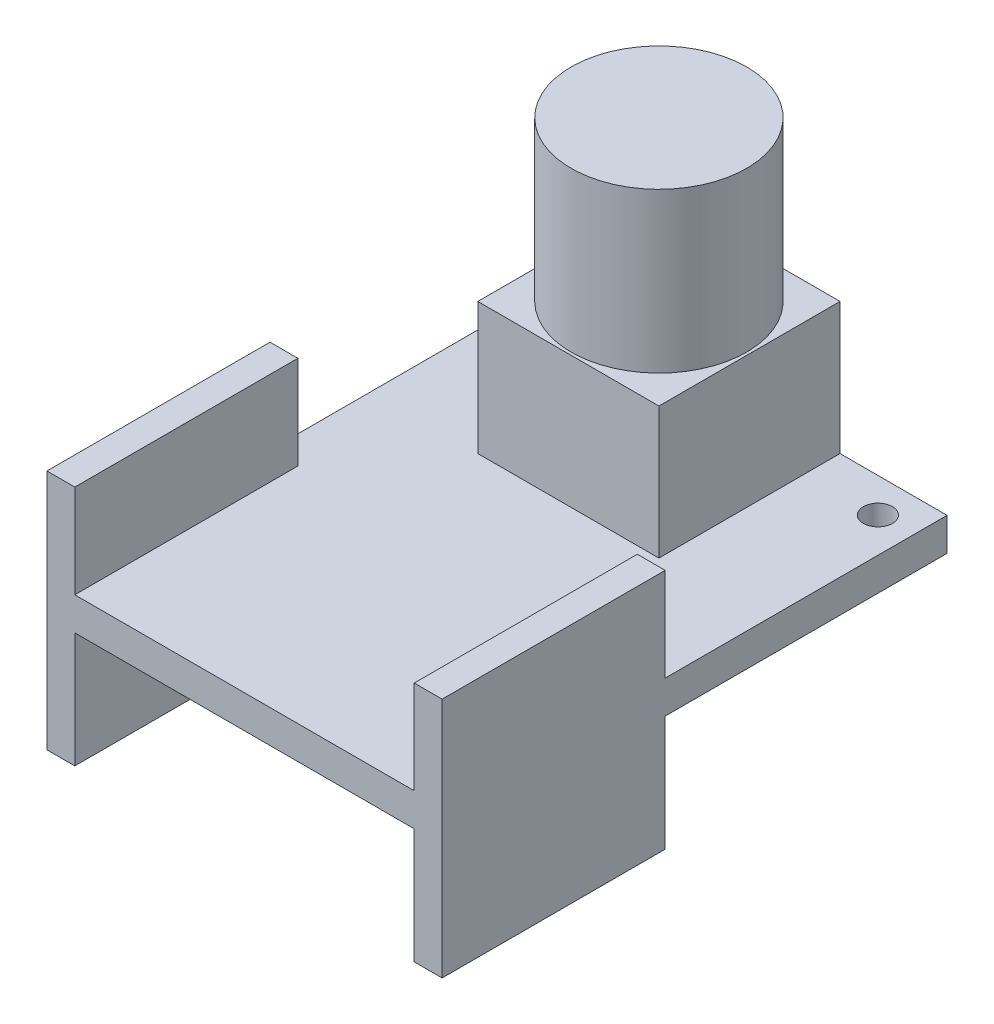
ISO-10303-21;
HEADER;
FILE_DESCRIPTION(('STEP AP214'),'2;1');
FILE_NAME('part.step','',(''),(''),'','','');
FILE_SCHEMA(('AUTOMOTIVE_DESIGN { 1 0 10303 214 1 1 1 1 }'));
ENDSEC;
DATA;
#1=APPLICATION_CONTEXT('core data for automotive mechanical design processes');
#2=APPLICATION_PROTOCOL_DEFINITION('international standard','automotive_design',2000,#1);
#3=PRODUCT_CONTEXT('',#1,'mechanical');
#4=PRODUCT('Part','Part','',(#3));
#5=PRODUCT_RELATED_PRODUCT_CATEGORY('part','',(#4));
#6=PRODUCT_DEFINITION_FORMATION('','',#4);
#7=PRODUCT_DEFINITION_CONTEXT('part definition',#1,'design');
#8=PRODUCT_DEFINITION('design','',#6,#7);
#9=PRODUCT_DEFINITION_SHAPE('','',#8);
#10=(LENGTH_UNIT() NAMED_UNIT(*) SI_UNIT(.MILLI.,.METRE.));
#11=(NAMED_UNIT(*) PLANE_ANGLE_UNIT() SI_UNIT($,.RADIAN.));
#12=(NAMED_UNIT(*) SI_UNIT($,.STERADIAN.) SOLID_ANGLE_UNIT());
#13=UNCERTAINTY_MEASURE_WITH_UNIT(LENGTH_MEASURE(1.E-05),#10,'distance_accuracy_value','');
#14=(GEOMETRIC_REPRESENTATION_CONTEXT(3) GLOBAL_UNCERTAINTY_ASSIGNED_CONTEXT((#13)) GLOBAL_UNIT_ASSIGNED_CONTEXT((#10,
#11,#12)) REPRESENTATION_CONTEXT('',''));
#15=CARTESIAN_POINT('',(0.,0.,0.));
#16=DIRECTION('',(0.,0.,1.));
#17=DIRECTION('',(1.,0.,0.));
#18=AXIS2_PLACEMENT_3D('',#15,#16,#17);
#19=CARTESIAN_POINT('',(18.,3.,23.));
#20=DIRECTION('',(-1.,0.,0.));
#21=DIRECTION('',(0.,0.,1.));
#22=AXIS2_PLACEMENT_3D('',#19,#20,#21);
#23=PLANE('',#22);
#24=DIRECTION('',(0.,0.,-1.));
#25=VECTOR('',#24,1.);
#26=CARTESIAN_POINT('',(18.,3.,23.));
#27=LINE('',#26,#25);
#28=CARTESIAN_POINT('',(18.,3.,2.68));
#29=VERTEX_POINT('',#28);
#30=CARTESIAN_POINT('',(18.,3.,-23.));
#31=VERTEX_POINT('',#30);
#32=EDGE_CURVE('E303',#29,#31,#27,.T.);
#33=ORIENTED_EDGE('',*,*,#32,.F.);
#34=DIRECTION('',(0.,1.,0.));
#35=VECTOR('',#34,1.);
#36=CARTESIAN_POINT('',(18.,-10.5,2.68));
#37=LINE('',#36,#35);
#38=CARTESIAN_POINT('',(18.,11.5,2.68));
#39=VERTEX_POINT('',#38);
#40=EDGE_CURVE('E286',#29,#39,#37,.T.);
#41=ORIENTED_EDGE('',*,*,#40,.T.);
#42=DIRECTION('',(0.,0.,-1.));
#43=VECTOR('',#42,1.);
#44=CARTESIAN_POINT('',(18.,11.5,23.));
#45=LINE('',#44,#43);
#46=CARTESIAN_POINT('',(18.,11.5,23.));
#47=VERTEX_POINT('',#46);
#48=EDGE_CURVE('E265',#47,#39,#45,.T.);
#49=ORIENTED_EDGE('',*,*,#48,.F.);
#50=DIRECTION('',(0.,-1.,0.));
#51=VECTOR('',#50,1.);
#52=CARTESIAN_POINT('',(18.,3.,23.));
#53=LINE('',#52,#51);
#54=CARTESIAN_POINT('',(18.,-10.5,23.));
#55=VERTEX_POINT('',#54);
#56=EDGE_CURVE('E313',#47,#55,#53,.T.);
#57=ORIENTED_EDGE('',*,*,#56,.T.);
#58=DIRECTION('',(0.,0.,-1.));
#59=VECTOR('',#58,1.);
#60=CARTESIAN_POINT('',(18.,-10.5,23.));
#61=LINE('',#60,#59);
#62=CARTESIAN_POINT('',(18.,-10.5,2.68));
#63=VERTEX_POINT('',#62);
#64=EDGE_CURVE('E277',#55,#63,#61,.T.);
#65=ORIENTED_EDGE('',*,*,#64,.T.);
#66=CARTESIAN_POINT('',(18.,0.,2.68));
#67=VERTEX_POINT('',#66);
#68=EDGE_CURVE('E296',#63,#67,#37,.T.);
#69=ORIENTED_EDGE('',*,*,#68,.T.);
#70=DIRECTION('',(0.,0.,-1.));
#71=VECTOR('',#70,1.);
#72=CARTESIAN_POINT('',(18.,0.,23.));
#73=LINE('',#72,#71);
#74=CARTESIAN_POINT('',(18.,0.,-23.));
#75=VERTEX_POINT('',#74);
#76=EDGE_CURVE('E302',#67,#75,#73,.T.);
#77=ORIENTED_EDGE('',*,*,#76,.T.);
#78=DIRECTION('',(0.,-1.,0.));
#79=VECTOR('',#78,1.);
#80=CARTESIAN_POINT('',(18.,3.,-23.));
#81=LINE('',#80,#79);
#82=EDGE_CURVE('E327',#31,#75,#81,.T.);
#83=ORIENTED_EDGE('',*,*,#82,.F.);
#84=EDGE_LOOP('',(#33,#41,#49,#57,#65,#69,#77,#83));
#85=FACE_BOUND('',#84,.T.);
#86=ADVANCED_FACE('F48',(#85),#23,.F.);
#87=CARTESIAN_POINT('',(-18.,3.,-23.));
#88=DIRECTION('',(0.,0.,1.));
#89=DIRECTION('',(1.,0.,0.));
#90=AXIS2_PLACEMENT_3D('',#87,#88,#89);
#91=PLANE('',#90);
#92=DIRECTION('',(-1.,0.,0.));
#93=VECTOR('',#92,1.);
#94=CARTESIAN_POINT('',(-18.,0.,-23.));
#95=LINE('',#94,#93);
#96=CARTESIAN_POINT('',(-18.,0.,-23.));
#97=VERTEX_POINT('',#96);
#98=EDGE_CURVE('E315',#75,#97,#95,.T.);
#99=ORIENTED_EDGE('',*,*,#98,.T.);
#100=DIRECTION('',(0.,-1.,0.));
#101=VECTOR('',#100,1.);
#102=CARTESIAN_POINT('',(-18.,3.,-23.));
#103=LINE('',#102,#101);
#104=CARTESIAN_POINT('',(-18.,3.,-23.));
#105=VERTEX_POINT('',#104);
#106=EDGE_CURVE('E324',#105,#97,#103,.T.);
#107=ORIENTED_EDGE('',*,*,#106,.F.);
#108=DIRECTION('',(-1.,0.,0.));
#109=VECTOR('',#108,1.);
#110=CARTESIAN_POINT('',(-18.,3.,-23.));
#111=LINE('',#110,#109);
#112=CARTESIAN_POINT('',(-8.25,3.,-23.));
#113=VERTEX_POINT('',#112);
#114=EDGE_CURVE('E305',#113,#105,#111,.T.);
#115=ORIENTED_EDGE('',*,*,#114,.F.);
#116=DIRECTION('',(0.,1.,0.));
#117=VECTOR('',#116,1.);
#118=CARTESIAN_POINT('',(-8.25,-10.5,-23.));
#119=LINE('',#118,#117);
#120=CARTESIAN_POINT('',(-8.25,15.,-23.));
#121=VERTEX_POINT('',#120);
#122=EDGE_CURVE('E217',#113,#121,#119,.T.);
#123=ORIENTED_EDGE('',*,*,#122,.T.);
#124=DIRECTION('',(-1.,0.,0.));
#125=VECTOR('',#124,1.);
#126=CARTESIAN_POINT('',(8.25,15.,-23.));
#127=LINE('',#126,#125);
#128=CARTESIAN_POINT('',(8.25,15.,-23.));
#129=VERTEX_POINT('',#128);
#130=EDGE_CURVE('E203',#129,#121,#127,.T.);
#131=ORIENTED_EDGE('',*,*,#130,.F.);
#132=DIRECTION('',(0.,1.,0.));
#133=VECTOR('',#132,1.);
#134=CARTESIAN_POINT('',(8.25,-10.5,-23.));
#135=LINE('',#134,#133);
#136=CARTESIAN_POINT('',(8.25,3.,-23.));
#137=VERTEX_POINT('',#136);
#138=EDGE_CURVE('E199',#137,#129,#135,.T.);
#139=ORIENTED_EDGE('',*,*,#138,.F.);
#140=EDGE_CURVE('E307',#31,#137,#111,.T.);
#141=ORIENTED_EDGE('',*,*,#140,.F.);
#142=ORIENTED_EDGE('',*,*,#82,.T.);
#143=EDGE_LOOP('',(#99,#107,#115,#123,#131,#139,#141,#142));
#144=FACE_BOUND('',#143,.T.);
#145=ADVANCED_FACE('F363',(#144),#91,.F.);
#146=CARTESIAN_POINT('',(-18.,3.,23.));
#147=DIRECTION('',(1.,0.,0.));
#148=DIRECTION('',(0.,0.,-1.));
#149=AXIS2_PLACEMENT_3D('',#146,#147,#148);
#150=PLANE('',#149);
#151=DIRECTION('',(0.,0.,1.));
#152=VECTOR('',#151,1.);
#153=CARTESIAN_POINT('',(-18.,0.,23.));
#154=LINE('',#153,#152);
#155=CARTESIAN_POINT('',(-18.,0.,2.68));
#156=VERTEX_POINT('',#155);
#157=EDGE_CURVE('E317',#97,#156,#154,.T.);
#158=ORIENTED_EDGE('',*,*,#157,.T.);
#159=DIRECTION('',(0.,1.,0.));
#160=VECTOR('',#159,1.);
#161=CARTESIAN_POINT('',(-18.,-10.5,2.68));
#162=LINE('',#161,#160);
#163=CARTESIAN_POINT('',(-18.,-10.5,2.68));
#164=VERTEX_POINT('',#163);
#165=EDGE_CURVE('E224',#164,#156,#162,.T.);
#166=ORIENTED_EDGE('',*,*,#165,.F.);
#167=DIRECTION('',(0.,0.,1.));
#168=VECTOR('',#167,1.);
#169=CARTESIAN_POINT('',(-18.,-10.5,23.));
#170=LINE('',#169,#168);
#171=CARTESIAN_POINT('',(-18.,-10.5,23.));
#172=VERTEX_POINT('',#171);
#173=EDGE_CURVE('E240',#164,#172,#170,.T.);
#174=ORIENTED_EDGE('',*,*,#173,.T.);
#175=DIRECTION('',(0.,-1.,0.));
#176=VECTOR('',#175,1.);
#177=CARTESIAN_POINT('',(-18.,3.,23.));
#178=LINE('',#177,#176);
#179=CARTESIAN_POINT('',(-18.,11.5,23.));
#180=VERTEX_POINT('',#179);
#181=EDGE_CURVE('E322',#180,#172,#178,.T.);
#182=ORIENTED_EDGE('',*,*,#181,.F.);
#183=DIRECTION('',(0.,0.,1.));
#184=VECTOR('',#183,1.);
#185=CARTESIAN_POINT('',(-18.,11.5,23.));
#186=LINE('',#185,#184);
#187=CARTESIAN_POINT('',(-18.,11.5,2.68));
#188=VERTEX_POINT('',#187);
#189=EDGE_CURVE('E252',#188,#180,#186,.T.);
#190=ORIENTED_EDGE('',*,*,#189,.F.);
#191=CARTESIAN_POINT('',(-18.,3.,2.68));
#192=VERTEX_POINT('',#191);
#193=EDGE_CURVE('E227',#192,#188,#162,.T.);
#194=ORIENTED_EDGE('',*,*,#193,.F.);
#195=DIRECTION('',(0.,0.,1.));
#196=VECTOR('',#195,1.);
#197=CARTESIAN_POINT('',(-18.,3.,23.));
#198=LINE('',#197,#196);
#199=EDGE_CURVE('E309',#105,#192,#198,.T.);
#200=ORIENTED_EDGE('',*,*,#199,.F.);
#201=ORIENTED_EDGE('',*,*,#106,.T.);
#202=EDGE_LOOP('',(#158,#166,#174,#182,#190,#194,#200,#201));
#203=FACE_BOUND('',#202,.T.);
#204=ADVANCED_FACE('F374',(#203),#150,.F.);
#205=CARTESIAN_POINT('',(-18.,3.,23.));
#206=DIRECTION('',(0.,0.,-1.));
#207=DIRECTION('',(-1.,0.,0.));
#208=AXIS2_PLACEMENT_3D('',#205,#206,#207);
#209=PLANE('',#208);
#210=DIRECTION('',(1.,0.,0.));
#211=VECTOR('',#210,1.);
#212=CARTESIAN_POINT('',(-18.,3.,23.));
#213=LINE('',#212,#211);
#214=CARTESIAN_POINT('',(-15.46,3.,23.));
#215=VERTEX_POINT('',#214);
#216=CARTESIAN_POINT('',(15.46,3.,23.));
#217=VERTEX_POINT('',#216);
#218=EDGE_CURVE('E311',#215,#217,#213,.T.);
#219=ORIENTED_EDGE('',*,*,#218,.F.);
#220=DIRECTION('',(0.,1.,0.));
#221=VECTOR('',#220,1.);
#222=CARTESIAN_POINT('',(-15.46,-10.5,23.));
#223=LINE('',#222,#221);
#224=CARTESIAN_POINT('',(-15.46,11.5,23.));
#225=VERTEX_POINT('',#224);
#226=EDGE_CURVE('E231',#215,#225,#223,.T.);
#227=ORIENTED_EDGE('',*,*,#226,.T.);
#228=DIRECTION('',(1.,0.,0.));
#229=VECTOR('',#228,1.);
#230=CARTESIAN_POINT('',(-15.46,11.5,23.));
#231=LINE('',#230,#229);
#232=EDGE_CURVE('E249',#180,#225,#231,.T.);
#233=ORIENTED_EDGE('',*,*,#232,.F.);
#234=ORIENTED_EDGE('',*,*,#181,.T.);
#235=DIRECTION('',(1.,0.,0.));
#236=VECTOR('',#235,1.);
#237=CARTESIAN_POINT('',(-15.46,-10.5,23.));
#238=LINE('',#237,#236);
#239=CARTESIAN_POINT('',(-15.46,-10.5,23.));
#240=VERTEX_POINT('',#239);
#241=EDGE_CURVE('E237',#172,#240,#238,.T.);
#242=ORIENTED_EDGE('',*,*,#241,.T.);
#243=CARTESIAN_POINT('',(-15.46,0.,23.));
#244=VERTEX_POINT('',#243);
#245=EDGE_CURVE('E228',#240,#244,#223,.T.);
#246=ORIENTED_EDGE('',*,*,#245,.T.);
#247=DIRECTION('',(1.,0.,0.));
#248=VECTOR('',#247,1.);
#249=CARTESIAN_POINT('',(-18.,0.,23.));
#250=LINE('',#249,#248);
#251=CARTESIAN_POINT('',(15.46,0.,23.));
#252=VERTEX_POINT('',#251);
#253=EDGE_CURVE('E306',#244,#252,#250,.T.);
#254=ORIENTED_EDGE('',*,*,#253,.T.);
#255=DIRECTION('',(0.,1.,0.));
#256=VECTOR('',#255,1.);
#257=CARTESIAN_POINT('',(15.46,-10.5,23.));
#258=LINE('',#257,#256);
#259=CARTESIAN_POINT('',(15.46,-10.5,23.));
#260=VERTEX_POINT('',#259);
#261=EDGE_CURVE('E287',#260,#252,#258,.T.);
#262=ORIENTED_EDGE('',*,*,#261,.F.);
#263=DIRECTION('',(1.,0.,0.));
#264=VECTOR('',#263,1.);
#265=CARTESIAN_POINT('',(15.46,-10.5,23.));
#266=LINE('',#265,#264);
#267=EDGE_CURVE('E274',#260,#55,#266,.T.);
#268=ORIENTED_EDGE('',*,*,#267,.T.);
#269=ORIENTED_EDGE('',*,*,#56,.F.);
#270=DIRECTION('',(1.,0.,0.));
#271=VECTOR('',#270,1.);
#272=CARTESIAN_POINT('',(15.46,11.5,23.));
#273=LINE('',#272,#271);
#274=CARTESIAN_POINT('',(15.46,11.5,23.));
#275=VERTEX_POINT('',#274);
#276=EDGE_CURVE('E262',#275,#47,#273,.T.);
#277=ORIENTED_EDGE('',*,*,#276,.F.);
#278=EDGE_CURVE('E291',#217,#275,#258,.T.);
#279=ORIENTED_EDGE('',*,*,#278,.F.);
#280=EDGE_LOOP('',(#219,#227,#233,#234,#242,#246,#254,#262,#268,#269,#277,#279));
#281=FACE_BOUND('',#280,.T.);
#282=ADVANCED_FACE('F357',(#281),#209,.F.);
#283=CARTESIAN_POINT('',(0.,3.,0.));
#284=DIRECTION('',(0.,-1.,0.));
#285=DIRECTION('',(0.,0.,-1.));
#286=AXIS2_PLACEMENT_3D('',#283,#284,#285);
#287=PLANE('',#286);
#288=CARTESIAN_POINT('',(-14.825,3.,-19.875));
#289=DIRECTION('',(0.,1.,0.));
#290=DIRECTION('',(0.,0.,1.));
#291=AXIS2_PLACEMENT_3D('',#288,#289,#290);
#292=CIRCLE('',#291,1.325);
#293=CARTESIAN_POINT('',(-14.825,3.,-18.55));
#294=VERTEX_POINT('',#293);
#295=EDGE_CURVE('E339',#294,#294,#292,.T.);
#296=ORIENTED_EDGE('',*,*,#295,.F.);
#297=EDGE_LOOP('',(#296));
#298=FACE_BOUND('',#297,.T.);
#299=CARTESIAN_POINT('',(14.825,3.,-19.875));
#300=DIRECTION('',(0.,1.,0.));
#301=DIRECTION('',(0.,0.,-1.));
#302=AXIS2_PLACEMENT_3D('',#299,#300,#301);
#303=CIRCLE('',#302,1.325);
#304=CARTESIAN_POINT('',(14.825,3.,-18.55));
#305=VERTEX_POINT('',#304);
#306=EDGE_CURVE('E344',#305,#305,#303,.T.);
#307=ORIENTED_EDGE('',*,*,#306,.F.);
#308=EDGE_LOOP('',(#307));
#309=FACE_BOUND('',#308,.T.);
#310=ORIENTED_EDGE('',*,*,#140,.T.);
#311=DIRECTION('',(0.,0.,1.));
#312=VECTOR('',#311,1.);
#313=CARTESIAN_POINT('',(8.25,3.,0.));
#314=LINE('',#313,#312);
#315=CARTESIAN_POINT('',(8.25,3.,-6.5));
#316=VERTEX_POINT('',#315);
#317=EDGE_CURVE('E64',#137,#316,#314,.T.);
#318=ORIENTED_EDGE('',*,*,#317,.T.);
#319=DIRECTION('',(-1.,0.,0.));
#320=VECTOR('',#319,1.);
#321=CARTESIAN_POINT('',(0.,3.,-6.5));
#322=LINE('',#321,#320);
#323=CARTESIAN_POINT('',(-8.25,3.,-6.5));
#324=VERTEX_POINT('',#323);
#325=EDGE_CURVE('E68',#316,#324,#322,.T.);
#326=ORIENTED_EDGE('',*,*,#325,.T.);
#327=DIRECTION('',(0.,0.,-1.));
#328=VECTOR('',#327,1.);
#329=CARTESIAN_POINT('',(-8.25,3.,0.));
#330=LINE('',#329,#328);
#331=EDGE_CURVE('E216',#324,#113,#330,.T.);
#332=ORIENTED_EDGE('',*,*,#331,.T.);
#333=ORIENTED_EDGE('',*,*,#114,.T.);
#334=ORIENTED_EDGE('',*,*,#199,.T.);
#335=DIRECTION('',(1.,0.,0.));
#336=VECTOR('',#335,1.);
#337=CARTESIAN_POINT('',(0.,3.,2.68));
#338=LINE('',#337,#336);
#339=CARTESIAN_POINT('',(-15.46,3.,2.68));
#340=VERTEX_POINT('',#339);
#341=EDGE_CURVE('E260',#192,#340,#338,.T.);
#342=ORIENTED_EDGE('',*,*,#341,.T.);
#343=DIRECTION('',(0.,0.,1.));
#344=VECTOR('',#343,1.);
#345=CARTESIAN_POINT('',(-15.46,3.,0.));
#346=LINE('',#345,#344);
#347=EDGE_CURVE('E258',#340,#215,#346,.T.);
#348=ORIENTED_EDGE('',*,*,#347,.T.);
#349=ORIENTED_EDGE('',*,*,#218,.T.);
#350=DIRECTION('',(0.,0.,-1.));
#351=VECTOR('',#350,1.);
#352=CARTESIAN_POINT('',(15.46,3.,0.));
#353=LINE('',#352,#351);
#354=CARTESIAN_POINT('',(15.46,3.,2.68));
#355=VERTEX_POINT('',#354);
#356=EDGE_CURVE('E300',#217,#355,#353,.T.);
#357=ORIENTED_EDGE('',*,*,#356,.T.);
#358=DIRECTION('',(1.,0.,0.));
#359=VECTOR('',#358,1.);
#360=CARTESIAN_POINT('',(0.,3.,2.68));
#361=LINE('',#360,#359);
#362=EDGE_CURVE('E290',#355,#29,#361,.T.);
#363=ORIENTED_EDGE('',*,*,#362,.T.);
#364=ORIENTED_EDGE('',*,*,#32,.T.);
#365=EDGE_LOOP('',(#310,#318,#326,#332,#333,#334,#342,#348,#349,#357,#363,#364));
#366=FACE_BOUND('',#365,.T.);
#367=ADVANCED_FACE('F354',(#298,#309,#366),#287,.F.);
#368=CARTESIAN_POINT('',(0.,0.,0.));
#369=DIRECTION('',(0.,-1.,0.));
#370=DIRECTION('',(0.,0.,-1.));
#371=AXIS2_PLACEMENT_3D('',#368,#369,#370);
#372=PLANE('',#371);
#373=ORIENTED_EDGE('',*,*,#157,.F.);
#374=ORIENTED_EDGE('',*,*,#98,.F.);
#375=ORIENTED_EDGE('',*,*,#76,.F.);
#376=DIRECTION('',(1.,0.,0.));
#377=VECTOR('',#376,1.);
#378=CARTESIAN_POINT('',(0.,0.,2.68));
#379=LINE('',#378,#377);
#380=CARTESIAN_POINT('',(15.46,0.,2.68));
#381=VERTEX_POINT('',#380);
#382=EDGE_CURVE('E330',#381,#67,#379,.T.);
#383=ORIENTED_EDGE('',*,*,#382,.F.);
#384=DIRECTION('',(0.,0.,-1.));
#385=VECTOR('',#384,1.);
#386=CARTESIAN_POINT('',(15.46,0.,0.));
#387=LINE('',#386,#385);
#388=EDGE_CURVE('E333',#252,#381,#387,.T.);
#389=ORIENTED_EDGE('',*,*,#388,.F.);
#390=ORIENTED_EDGE('',*,*,#253,.F.);
#391=DIRECTION('',(0.,0.,1.));
#392=VECTOR('',#391,1.);
#393=CARTESIAN_POINT('',(-15.46,0.,0.));
#394=LINE('',#393,#392);
#395=CARTESIAN_POINT('',(-15.46,0.,2.68));
#396=VERTEX_POINT('',#395);
#397=EDGE_CURVE('E335',#396,#244,#394,.T.);
#398=ORIENTED_EDGE('',*,*,#397,.F.);
#399=DIRECTION('',(1.,0.,0.));
#400=VECTOR('',#399,1.);
#401=CARTESIAN_POINT('',(0.,0.,2.68));
#402=LINE('',#401,#400);
#403=EDGE_CURVE('E56',#156,#396,#402,.T.);
#404=ORIENTED_EDGE('',*,*,#403,.F.);
#405=EDGE_LOOP('',(#373,#374,#375,#383,#389,#390,#398,#404));
#406=FACE_BOUND('',#405,.T.);
#407=CARTESIAN_POINT('',(-14.825,0.,-19.875));
#408=DIRECTION('',(0.,-1.,0.));
#409=DIRECTION('',(0.,0.,-1.));
#410=AXIS2_PLACEMENT_3D('',#407,#408,#409);
#411=CIRCLE('',#410,1.325);
#412=CARTESIAN_POINT('',(-14.825,0.,-18.55));
#413=VERTEX_POINT('',#412);
#414=EDGE_CURVE('E51',#413,#413,#411,.T.);
#415=ORIENTED_EDGE('',*,*,#414,.F.);
#416=EDGE_LOOP('',(#415));
#417=FACE_BOUND('',#416,.T.);
#418=CARTESIAN_POINT('',(14.825,0.,-19.875));
#419=DIRECTION('',(0.,-1.,0.));
#420=DIRECTION('',(0.,0.,-1.));
#421=AXIS2_PLACEMENT_3D('',#418,#419,#420);
#422=CIRCLE('',#421,1.325);
#423=CARTESIAN_POINT('',(14.825,0.,-18.55));
#424=VERTEX_POINT('',#423);
#425=EDGE_CURVE('E337',#424,#424,#422,.T.);
#426=ORIENTED_EDGE('',*,*,#425,.F.);
#427=EDGE_LOOP('',(#426));
#428=FACE_BOUND('',#427,.T.);
#429=ADVANCED_FACE('F356',(#406,#417,#428),#372,.T.);
#430=CARTESIAN_POINT('',(0.,-10.5,0.));
#431=DIRECTION('',(0.,1.,0.));
#432=DIRECTION('',(0.,0.,1.));
#433=AXIS2_PLACEMENT_3D('',#430,#431,#432);
#434=PLANE('',#433);
#435=ORIENTED_EDGE('',*,*,#267,.F.);
#436=DIRECTION('',(0.,0.,1.));
#437=VECTOR('',#436,1.);
#438=CARTESIAN_POINT('',(15.46,-10.5,2.68));
#439=LINE('',#438,#437);
#440=CARTESIAN_POINT('',(15.46,-10.5,2.68));
#441=VERTEX_POINT('',#440);
#442=EDGE_CURVE('E283',#441,#260,#439,.T.);
#443=ORIENTED_EDGE('',*,*,#442,.F.);
#444=DIRECTION('',(-1.,0.,0.));
#445=VECTOR('',#444,1.);
#446=CARTESIAN_POINT('',(18.,-10.5,2.68));
#447=LINE('',#446,#445);
#448=EDGE_CURVE('E280',#63,#441,#447,.T.);
#449=ORIENTED_EDGE('',*,*,#448,.F.);
#450=ORIENTED_EDGE('',*,*,#64,.F.);
#451=EDGE_LOOP('',(#435,#443,#449,#450));
#452=FACE_BOUND('',#451,.T.);
#453=ADVANCED_FACE('F425',(#452),#434,.F.);
#454=CARTESIAN_POINT('',(18.,-10.5,2.68));
#455=DIRECTION('',(0.,0.,-1.));
#456=DIRECTION('',(-1.,0.,0.));
#457=AXIS2_PLACEMENT_3D('',#454,#455,#456);
#458=PLANE('',#457);
#459=DIRECTION('',(0.,1.,0.));
#460=VECTOR('',#459,1.);
#461=CARTESIAN_POINT('',(15.46,-10.5,2.68));
#462=LINE('',#461,#460);
#463=EDGE_CURVE('E292',#441,#381,#462,.T.);
#464=ORIENTED_EDGE('',*,*,#463,.T.);
#465=ORIENTED_EDGE('',*,*,#382,.T.);
#466=ORIENTED_EDGE('',*,*,#68,.F.);
#467=ORIENTED_EDGE('',*,*,#448,.T.);
#468=EDGE_LOOP('',(#464,#465,#466,#467));
#469=FACE_BOUND('',#468,.T.);
#470=ADVANCED_FACE('F428',(#469),#458,.T.);
#471=CARTESIAN_POINT('',(15.46,-10.5,2.68));
#472=DIRECTION('',(-1.,0.,0.));
#473=DIRECTION('',(0.,0.,1.));
#474=AXIS2_PLACEMENT_3D('',#471,#472,#473);
#475=PLANE('',#474);
#476=ORIENTED_EDGE('',*,*,#261,.T.);
#477=ORIENTED_EDGE('',*,*,#388,.T.);
#478=ORIENTED_EDGE('',*,*,#463,.F.);
#479=ORIENTED_EDGE('',*,*,#442,.T.);
#480=EDGE_LOOP('',(#476,#477,#478,#479));
#481=FACE_BOUND('',#480,.T.);
#482=ADVANCED_FACE('F447',(#481),#475,.T.);
#483=ORIENTED_EDGE('',*,*,#356,.F.);
#484=ORIENTED_EDGE('',*,*,#278,.T.);
#485=DIRECTION('',(0.,0.,1.));
#486=VECTOR('',#485,1.);
#487=CARTESIAN_POINT('',(15.46,11.5,2.68));
#488=LINE('',#487,#486);
#489=CARTESIAN_POINT('',(15.46,11.5,2.68));
#490=VERTEX_POINT('',#489);
#491=EDGE_CURVE('E271',#490,#275,#488,.T.);
#492=ORIENTED_EDGE('',*,*,#491,.F.);
#493=EDGE_CURVE('E295',#355,#490,#462,.T.);
#494=ORIENTED_EDGE('',*,*,#493,.F.);
#495=EDGE_LOOP('',(#483,#484,#492,#494));
#496=FACE_BOUND('',#495,.T.);
#497=ADVANCED_FACE('F420',(#496),#475,.T.);
#498=ORIENTED_EDGE('',*,*,#362,.F.);
#499=ORIENTED_EDGE('',*,*,#493,.T.);
#500=DIRECTION('',(-1.,0.,0.));
#501=VECTOR('',#500,1.);
#502=CARTESIAN_POINT('',(18.,11.5,2.68));
#503=LINE('',#502,#501);
#504=EDGE_CURVE('E268',#39,#490,#503,.T.);
#505=ORIENTED_EDGE('',*,*,#504,.F.);
#506=ORIENTED_EDGE('',*,*,#40,.F.);
#507=EDGE_LOOP('',(#498,#499,#505,#506));
#508=FACE_BOUND('',#507,.T.);
#509=ADVANCED_FACE('F414',(#508),#458,.T.);
#510=CARTESIAN_POINT('',(0.,11.5,0.));
#511=DIRECTION('',(0.,1.,0.));
#512=DIRECTION('',(0.,0.,1.));
#513=AXIS2_PLACEMENT_3D('',#510,#511,#512);
#514=PLANE('',#513);
#515=ORIENTED_EDGE('',*,*,#276,.T.);
#516=ORIENTED_EDGE('',*,*,#48,.T.);
#517=ORIENTED_EDGE('',*,*,#504,.T.);
#518=ORIENTED_EDGE('',*,*,#491,.T.);
#519=EDGE_LOOP('',(#515,#516,#517,#518));
#520=FACE_BOUND('',#519,.T.);
#521=ADVANCED_FACE('F417',(#520),#514,.T.);
#522=CARTESIAN_POINT('',(0.,-10.5,0.));
#523=DIRECTION('',(0.,-1.,0.));
#524=DIRECTION('',(0.,0.,-1.));
#525=AXIS2_PLACEMENT_3D('',#522,#523,#524);
#526=PLANE('',#525);
#527=DIRECTION('',(-1.,0.,0.));
#528=VECTOR('',#527,1.);
#529=CARTESIAN_POINT('',(-18.,-10.5,2.68));
#530=LINE('',#529,#528);
#531=CARTESIAN_POINT('',(-15.46,-10.5,2.68));
#532=VERTEX_POINT('',#531);
#533=EDGE_CURVE('E243',#532,#164,#530,.T.);
#534=ORIENTED_EDGE('',*,*,#533,.F.);
#535=DIRECTION('',(0.,0.,-1.));
#536=VECTOR('',#535,1.);
#537=CARTESIAN_POINT('',(-15.46,-10.5,2.68));
#538=LINE('',#537,#536);
#539=EDGE_CURVE('E226',#240,#532,#538,.T.);
#540=ORIENTED_EDGE('',*,*,#539,.F.);
#541=ORIENTED_EDGE('',*,*,#241,.F.);
#542=ORIENTED_EDGE('',*,*,#173,.F.);
#543=EDGE_LOOP('',(#534,#540,#541,#542));
#544=FACE_BOUND('',#543,.T.);
#545=ADVANCED_FACE('F440',(#544),#526,.T.);
#546=CARTESIAN_POINT('',(-15.46,-10.5,2.68));
#547=DIRECTION('',(1.,0.,0.));
#548=DIRECTION('',(0.,0.,-1.));
#549=AXIS2_PLACEMENT_3D('',#546,#547,#548);
#550=PLANE('',#549);
#551=DIRECTION('',(0.,1.,0.));
#552=VECTOR('',#551,1.);
#553=CARTESIAN_POINT('',(-15.46,-10.5,2.68));
#554=LINE('',#553,#552);
#555=EDGE_CURVE('E232',#532,#396,#554,.T.);
#556=ORIENTED_EDGE('',*,*,#555,.T.);
#557=ORIENTED_EDGE('',*,*,#397,.T.);
#558=ORIENTED_EDGE('',*,*,#245,.F.);
#559=ORIENTED_EDGE('',*,*,#539,.T.);
#560=EDGE_LOOP('',(#556,#557,#558,#559));
#561=FACE_BOUND('',#560,.T.);
#562=ADVANCED_FACE('F399',(#561),#550,.T.);
#563=CARTESIAN_POINT('',(-18.,-10.5,2.68));
#564=DIRECTION('',(0.,0.,-1.));
#565=DIRECTION('',(-1.,0.,0.));
#566=AXIS2_PLACEMENT_3D('',#563,#564,#565);
#567=PLANE('',#566);
#568=ORIENTED_EDGE('',*,*,#165,.T.);
#569=ORIENTED_EDGE('',*,*,#403,.T.);
#570=ORIENTED_EDGE('',*,*,#555,.F.);
#571=ORIENTED_EDGE('',*,*,#533,.T.);
#572=EDGE_LOOP('',(#568,#569,#570,#571));
#573=FACE_BOUND('',#572,.T.);
#574=ADVANCED_FACE('F442',(#573),#567,.T.);
#575=ORIENTED_EDGE('',*,*,#341,.F.);
#576=ORIENTED_EDGE('',*,*,#193,.T.);
#577=DIRECTION('',(-1.,0.,0.));
#578=VECTOR('',#577,1.);
#579=CARTESIAN_POINT('',(-18.,11.5,2.68));
#580=LINE('',#579,#578);
#581=CARTESIAN_POINT('',(-15.46,11.5,2.68));
#582=VERTEX_POINT('',#581);
#583=EDGE_CURVE('E255',#582,#188,#580,.T.);
#584=ORIENTED_EDGE('',*,*,#583,.F.);
#585=EDGE_CURVE('E223',#340,#582,#554,.T.);
#586=ORIENTED_EDGE('',*,*,#585,.F.);
#587=EDGE_LOOP('',(#575,#576,#584,#586));
#588=FACE_BOUND('',#587,.T.);
#589=ADVANCED_FACE('F378',(#588),#567,.T.);
#590=ORIENTED_EDGE('',*,*,#347,.F.);
#591=ORIENTED_EDGE('',*,*,#585,.T.);
#592=DIRECTION('',(0.,0.,-1.));
#593=VECTOR('',#592,1.);
#594=CARTESIAN_POINT('',(-15.46,11.5,2.68));
#595=LINE('',#594,#593);
#596=EDGE_CURVE('E246',#225,#582,#595,.T.);
#597=ORIENTED_EDGE('',*,*,#596,.F.);
#598=ORIENTED_EDGE('',*,*,#226,.F.);
#599=EDGE_LOOP('',(#590,#591,#597,#598));
#600=FACE_BOUND('',#599,.T.);
#601=ADVANCED_FACE('F384',(#600),#550,.T.);
#602=CARTESIAN_POINT('',(0.,11.5,0.));
#603=DIRECTION('',(0.,-1.,0.));
#604=DIRECTION('',(0.,0.,-1.));
#605=AXIS2_PLACEMENT_3D('',#602,#603,#604);
#606=PLANE('',#605);
#607=ORIENTED_EDGE('',*,*,#583,.T.);
#608=ORIENTED_EDGE('',*,*,#189,.T.);
#609=ORIENTED_EDGE('',*,*,#232,.T.);
#610=ORIENTED_EDGE('',*,*,#596,.T.);
#611=EDGE_LOOP('',(#607,#608,#609,#610));
#612=FACE_BOUND('',#611,.T.);
#613=ADVANCED_FACE('F390',(#612),#606,.F.);
#614=CARTESIAN_POINT('',(8.25,-10.5,-6.5));
#615=DIRECTION('',(1.,0.,0.));
#616=DIRECTION('',(0.,0.,-1.));
#617=AXIS2_PLACEMENT_3D('',#614,#615,#616);
#618=PLANE('',#617);
#619=ORIENTED_EDGE('',*,*,#317,.F.);
#620=ORIENTED_EDGE('',*,*,#138,.T.);
#621=DIRECTION('',(0.,0.,-1.));
#622=VECTOR('',#621,1.);
#623=CARTESIAN_POINT('',(8.25,15.,-6.5));
#624=LINE('',#623,#622);
#625=CARTESIAN_POINT('',(8.25,15.,-6.5));
#626=VERTEX_POINT('',#625);
#627=EDGE_CURVE('E196',#626,#129,#624,.T.);
#628=ORIENTED_EDGE('',*,*,#627,.F.);
#629=DIRECTION('',(0.,1.,0.));
#630=VECTOR('',#629,1.);
#631=CARTESIAN_POINT('',(8.25,-10.5,-6.5));
#632=LINE('',#631,#630);
#633=EDGE_CURVE('E185',#316,#626,#632,.T.);
#634=ORIENTED_EDGE('',*,*,#633,.F.);
#635=EDGE_LOOP('',(#619,#620,#628,#634));
#636=FACE_BOUND('',#635,.T.);
#637=ADVANCED_FACE('F197',(#636),#618,.T.);
#638=CARTESIAN_POINT('',(-8.25,-10.5,-6.5));
#639=DIRECTION('',(0.,0.,1.));
#640=DIRECTION('',(1.,0.,0.));
#641=AXIS2_PLACEMENT_3D('',#638,#639,#640);
#642=PLANE('',#641);
#643=ORIENTED_EDGE('',*,*,#325,.F.);
#644=ORIENTED_EDGE('',*,*,#633,.T.);
#645=DIRECTION('',(1.,0.,0.));
#646=VECTOR('',#645,1.);
#647=CARTESIAN_POINT('',(-8.25,15.,-6.5));
#648=LINE('',#647,#646);
#649=CARTESIAN_POINT('',(-8.25,15.,-6.5));
#650=VERTEX_POINT('',#649);
#651=EDGE_CURVE('E190',#650,#626,#648,.T.);
#652=ORIENTED_EDGE('',*,*,#651,.F.);
#653=DIRECTION('',(0.,1.,0.));
#654=VECTOR('',#653,1.);
#655=CARTESIAN_POINT('',(-8.25,-10.5,-6.5));
#656=LINE('',#655,#654);
#657=EDGE_CURVE('E192',#324,#650,#656,.T.);
#658=ORIENTED_EDGE('',*,*,#657,.F.);
#659=EDGE_LOOP('',(#643,#644,#652,#658));
#660=FACE_BOUND('',#659,.T.);
#661=ADVANCED_FACE('F187',(#660),#642,.T.);
#662=CARTESIAN_POINT('',(-8.25,-10.5,-6.5));
#663=DIRECTION('',(-1.,0.,0.));
#664=DIRECTION('',(0.,0.,1.));
#665=AXIS2_PLACEMENT_3D('',#662,#663,#664);
#666=PLANE('',#665);
#667=ORIENTED_EDGE('',*,*,#331,.F.);
#668=ORIENTED_EDGE('',*,*,#657,.T.);
#669=DIRECTION('',(0.,0.,1.));
#670=VECTOR('',#669,1.);
#671=CARTESIAN_POINT('',(-8.25,15.,-23.));
#672=LINE('',#671,#670);
#673=EDGE_CURVE('E193',#121,#650,#672,.T.);
#674=ORIENTED_EDGE('',*,*,#673,.F.);
#675=ORIENTED_EDGE('',*,*,#122,.F.);
#676=EDGE_LOOP('',(#667,#668,#674,#675));
#677=FACE_BOUND('',#676,.T.);
#678=ADVANCED_FACE('F366',(#677),#666,.T.);
#679=CARTESIAN_POINT('',(0.,15.,0.));
#680=DIRECTION('',(0.,1.,0.));
#681=DIRECTION('',(0.,0.,1.));
#682=AXIS2_PLACEMENT_3D('',#679,#680,#681);
#683=PLANE('',#682);
#684=CARTESIAN_POINT('',(0.,15.,-14.75));
#685=DIRECTION('',(0.,1.,0.));
#686=DIRECTION('',(0.,0.,1.));
#687=AXIS2_PLACEMENT_3D('',#684,#685,#686);
#688=CIRCLE('',#687,8.);
#689=CARTESIAN_POINT('',(0.,15.,-22.75));
#690=VERTEX_POINT('',#689);
#691=EDGE_CURVE('E12',#690,#690,#688,.T.);
#692=ORIENTED_EDGE('',*,*,#691,.F.);
#693=EDGE_LOOP('',(#692));
#694=FACE_BOUND('',#693,.T.);
#695=ORIENTED_EDGE('',*,*,#651,.T.);
#696=ORIENTED_EDGE('',*,*,#627,.T.);
#697=ORIENTED_EDGE('',*,*,#130,.T.);
#698=ORIENTED_EDGE('',*,*,#673,.T.);
#699=EDGE_LOOP('',(#695,#696,#697,#698));
#700=FACE_BOUND('',#699,.T.);
#701=ADVANCED_FACE('F206',(#694,#700),#683,.T.);
#702=CARTESIAN_POINT('',(0.,29.5,-14.75));
#703=DIRECTION('',(0.,-1.,0.));
#704=DIRECTION('',(0.,0.,-1.));
#705=AXIS2_PLACEMENT_3D('',#702,#703,#704);
#706=CYLINDRICAL_SURFACE('',#705,8.);
#707=CARTESIAN_POINT('',(0.,29.5,-14.75));
#708=DIRECTION('',(0.,1.,0.));
#709=DIRECTION('',(0.,0.,1.));
#710=AXIS2_PLACEMENT_3D('',#707,#708,#709);
#711=CIRCLE('',#710,8.);
#712=CARTESIAN_POINT('',(0.,29.5,-22.75));
#713=VERTEX_POINT('',#712);
#714=EDGE_CURVE('E208',#713,#713,#711,.T.);
#715=CARTESIAN_POINT('',(0.,29.5,-22.75));
#716=CARTESIAN_POINT('',(0.,29.3489583333333,-22.75));
#717=CARTESIAN_POINT('',(0.,29.1979166666667,-22.75));
#718=CARTESIAN_POINT('',(0.,28.8958333333333,-22.75));
#719=CARTESIAN_POINT('',(0.,28.7447916666667,-22.75));
#720=CARTESIAN_POINT('',(0.,28.4427083333333,-22.75));
#721=CARTESIAN_POINT('',(0.,28.2916666666667,-22.75));
#722=CARTESIAN_POINT('',(0.,27.9895833333333,-22.75));
#723=CARTESIAN_POINT('',(0.,27.8385416666667,-22.75));
#724=CARTESIAN_POINT('',(0.,27.5364583333333,-22.75));
#725=CARTESIAN_POINT('',(0.,27.3854166666667,-22.75));
#726=CARTESIAN_POINT('',(0.,27.0833333333333,-22.75));
#727=CARTESIAN_POINT('',(0.,26.9322916666667,-22.75));
#728=CARTESIAN_POINT('',(0.,26.6302083333333,-22.75));
#729=CARTESIAN_POINT('',(0.,26.4791666666667,-22.75));
#730=CARTESIAN_POINT('',(0.,26.1770833333333,-22.75));
#731=CARTESIAN_POINT('',(0.,26.0260416666667,-22.75));
#732=CARTESIAN_POINT('',(0.,25.7239583333333,-22.75));
#733=CARTESIAN_POINT('',(0.,25.5729166666667,-22.75));
#734=CARTESIAN_POINT('',(0.,25.2708333333333,-22.75));
#735=CARTESIAN_POINT('',(0.,25.1197916666667,-22.75));
#736=CARTESIAN_POINT('',(0.,24.8177083333333,-22.75));
#737=CARTESIAN_POINT('',(0.,24.6666666666667,-22.75));
#738=CARTESIAN_POINT('',(0.,24.3645833333333,-22.75));
#739=CARTESIAN_POINT('',(0.,24.2135416666667,-22.75));
#740=CARTESIAN_POINT('',(0.,23.9114583333333,-22.75));
#741=CARTESIAN_POINT('',(0.,23.7604166666667,-22.75));
#742=CARTESIAN_POINT('',(0.,23.4583333333333,-22.75));
#743=CARTESIAN_POINT('',(0.,23.3072916666667,-22.75));
#744=CARTESIAN_POINT('',(0.,23.0052083333333,-22.75));
#745=CARTESIAN_POINT('',(0.,22.8541666666667,-22.75));
#746=CARTESIAN_POINT('',(0.,22.5520833333333,-22.75));
#747=CARTESIAN_POINT('',(0.,22.4010416666667,-22.75));
#748=CARTESIAN_POINT('',(0.,22.0989583333333,-22.75));
#749=CARTESIAN_POINT('',(0.,21.9479166666667,-22.75));
#750=CARTESIAN_POINT('',(0.,21.6458333333333,-22.75));
#751=CARTESIAN_POINT('',(0.,21.4947916666667,-22.75));
#752=CARTESIAN_POINT('',(0.,21.1927083333333,-22.75));
#753=CARTESIAN_POINT('',(0.,21.0416666666667,-22.75));
#754=CARTESIAN_POINT('',(0.,20.7395833333333,-22.75));
#755=CARTESIAN_POINT('',(0.,20.5885416666667,-22.75));
#756=CARTESIAN_POINT('',(0.,20.2864583333333,-22.75));
#757=CARTESIAN_POINT('',(0.,20.1354166666667,-22.75));
#758=CARTESIAN_POINT('',(0.,19.8333333333333,-22.75));
#759=CARTESIAN_POINT('',(0.,19.6822916666667,-22.75));
#760=CARTESIAN_POINT('',(0.,19.3802083333333,-22.75));
#761=CARTESIAN_POINT('',(0.,19.2291666666667,-22.75));
#762=CARTESIAN_POINT('',(0.,18.9270833333333,-22.75));
#763=CARTESIAN_POINT('',(0.,18.7760416666667,-22.75));
#764=CARTESIAN_POINT('',(0.,18.4739583333333,-22.75));
#765=CARTESIAN_POINT('',(0.,18.3229166666667,-22.75));
#766=CARTESIAN_POINT('',(0.,18.0208333333333,-22.75));
#767=CARTESIAN_POINT('',(0.,17.8697916666667,-22.75));
#768=CARTESIAN_POINT('',(0.,17.5677083333333,-22.75));
#769=CARTESIAN_POINT('',(0.,17.4166666666667,-22.75));
#770=CARTESIAN_POINT('',(0.,17.1145833333333,-22.75));
#771=CARTESIAN_POINT('',(0.,16.9635416666667,-22.75));
#772=CARTESIAN_POINT('',(0.,16.6614583333333,-22.75));
#773=CARTESIAN_POINT('',(0.,16.5104166666667,-22.75));
#774=CARTESIAN_POINT('',(0.,16.2083333333333,-22.75));
#775=CARTESIAN_POINT('',(0.,16.0572916666667,-22.75));
#776=CARTESIAN_POINT('',(0.,15.7552083333333,-22.75));
#777=CARTESIAN_POINT('',(0.,15.6041666666667,-22.75));
#778=CARTESIAN_POINT('',(0.,15.3020833333333,-22.75));
#779=CARTESIAN_POINT('',(0.,15.1510416666667,-22.75));
#780=CARTESIAN_POINT('',(0.,15.,-22.75));
#781=B_SPLINE_CURVE_WITH_KNOTS('',3,(#715,#716,#717,#718,#719,#720,#721,#722,#723,#724,#725,
#726,#727,#728,#729,#730,#731,#732,#733,#734,#735,#736,#737,#738,#739,#740,#741,#742,#743,#744,
#745,#746,#747,#748,#749,#750,#751,#752,#753,#754,#755,#756,#757,#758,#759,#760,#761,#762,#763,
#764,#765,#766,#767,#768,#769,#770,#771,#772,#773,#774,#775,#776,#777,#778,#779,#780),
.UNSPECIFIED.,.F.,.F.,(4,2,2,2,2,2,2,2,2,2,2,2,2,2,2,2,2,2,2,2,2,2,2,2,2,2,2,2,2,2,2,2,4),(0.,
0.453125000000002,0.906250000000001,1.359375,1.8125,2.265625,2.71875,3.171875,3.625,4.078125,
4.53125,4.984375,5.4375,5.890625,6.34375,6.796875,7.25,7.703125,8.15625,8.609375,9.0625,
9.515625,9.96875,10.421875,10.875,11.328125,11.78125,12.234375,12.6875,13.140625,13.59375,
14.046875,14.5),.UNSPECIFIED.);
#782=EDGE_CURVE('BSEAM550',#713,#690,#781,.T.);
#783=ORIENTED_EDGE('',*,*,#714,.F.);
#784=ORIENTED_EDGE('',*,*,#691,.T.);
#785=ORIENTED_EDGE('',*,*,#782,.T.);
#786=ORIENTED_EDGE('',*,*,#782,.F.);
#787=EDGE_LOOP('',(#783,#785,#784,#786));
#788=FACE_BOUND('',#787,.T.);
#789=ADVANCED_FACE('F550',(#788),#706,.T.);
#790=CARTESIAN_POINT('',(0.,29.5,-14.75));
#791=DIRECTION('',(0.,1.,0.));
#792=DIRECTION('',(0.,0.,1.));
#793=AXIS2_PLACEMENT_3D('',#790,#791,#792);
#794=PLANE('',#793);
#795=ORIENTED_EDGE('',*,*,#714,.T.);
#796=EDGE_LOOP('',(#795));
#797=FACE_BOUND('',#796,.T.);
#798=ADVANCED_FACE('F560',(#797),#794,.T.);
#799=CARTESIAN_POINT('',(14.825,-11.5,-19.875));
#800=DIRECTION('',(0.,1.,0.));
#801=DIRECTION('',(0.,0.,1.));
#802=AXIS2_PLACEMENT_3D('',#799,#800,#801);
#803=CYLINDRICAL_SURFACE('',#802,1.325);
#804=CARTESIAN_POINT('',(14.825,0.,-18.55));
#805=CARTESIAN_POINT('',(14.825,0.0312500000000018,-18.55));
#806=CARTESIAN_POINT('',(14.825,0.0625000000000018,-18.55));
#807=CARTESIAN_POINT('',(14.825,0.125000000000002,-18.55));
#808=CARTESIAN_POINT('',(14.825,0.156250000000002,-18.55));
#809=CARTESIAN_POINT('',(14.825,0.218750000000002,-18.55));
#810=CARTESIAN_POINT('',(14.825,0.250000000000002,-18.55));
#811=CARTESIAN_POINT('',(14.825,0.312500000000002,-18.55));
#812=CARTESIAN_POINT('',(14.825,0.343750000000002,-18.55));
#813=CARTESIAN_POINT('',(14.825,0.406250000000002,-18.55));
#814=CARTESIAN_POINT('',(14.825,0.437500000000002,-18.55));
#815=CARTESIAN_POINT('',(14.825,0.500000000000002,-18.55));
#816=CARTESIAN_POINT('',(14.825,0.531250000000002,-18.55));
#817=CARTESIAN_POINT('',(14.825,0.593750000000002,-18.55));
#818=CARTESIAN_POINT('',(14.825,0.625000000000002,-18.55));
#819=CARTESIAN_POINT('',(14.825,0.687500000000002,-18.55));
#820=CARTESIAN_POINT('',(14.825,0.718750000000002,-18.55));
#821=CARTESIAN_POINT('',(14.825,0.781250000000002,-18.55));
#822=CARTESIAN_POINT('',(14.825,0.812500000000001,-18.55));
#823=CARTESIAN_POINT('',(14.825,0.875000000000001,-18.55));
#824=CARTESIAN_POINT('',(14.825,0.906250000000001,-18.55));
#825=CARTESIAN_POINT('',(14.825,0.968750000000001,-18.55));
#826=CARTESIAN_POINT('',(14.825,1.,-18.55));
#827=CARTESIAN_POINT('',(14.825,1.0625,-18.55));
#828=CARTESIAN_POINT('',(14.825,1.09375,-18.55));
#829=CARTESIAN_POINT('',(14.825,1.15625,-18.55));
#830=CARTESIAN_POINT('',(14.825,1.1875,-18.55));
#831=CARTESIAN_POINT('',(14.825,1.25,-18.55));
#832=CARTESIAN_POINT('',(14.825,1.28125,-18.55));
#833=CARTESIAN_POINT('',(14.825,1.34375,-18.55));
#834=CARTESIAN_POINT('',(14.825,1.375,-18.55));
#835=CARTESIAN_POINT('',(14.825,1.4375,-18.55));
#836=CARTESIAN_POINT('',(14.825,1.46875,-18.55));
#837=CARTESIAN_POINT('',(14.825,1.53125,-18.55));
#838=CARTESIAN_POINT('',(14.825,1.5625,-18.55));
#839=CARTESIAN_POINT('',(14.825,1.625,-18.55));
#840=CARTESIAN_POINT('',(14.825,1.65625,-18.55));
#841=CARTESIAN_POINT('',(14.825,1.71875,-18.55));
#842=CARTESIAN_POINT('',(14.825,1.75,-18.55));
#843=CARTESIAN_POINT('',(14.825,1.8125,-18.55));
#844=CARTESIAN_POINT('',(14.825,1.84375,-18.55));
#845=CARTESIAN_POINT('',(14.825,1.90625,-18.55));
#846=CARTESIAN_POINT('',(14.825,1.9375,-18.55));
#847=CARTESIAN_POINT('',(14.825,2.,-18.55));
#848=CARTESIAN_POINT('',(14.825,2.03125,-18.55));
#849=CARTESIAN_POINT('',(14.825,2.09375,-18.55));
#850=CARTESIAN_POINT('',(14.825,2.125,-18.55));
#851=CARTESIAN_POINT('',(14.825,2.1875,-18.55));
#852=CARTESIAN_POINT('',(14.825,2.21875,-18.55));
#853=CARTESIAN_POINT('',(14.825,2.28125,-18.55));
#854=CARTESIAN_POINT('',(14.825,2.3125,-18.55));
#855=CARTESIAN_POINT('',(14.825,2.375,-18.55));
#856=CARTESIAN_POINT('',(14.825,2.40625,-18.55));
#857=CARTESIAN_POINT('',(14.825,2.46875,-18.55));
#858=CARTESIAN_POINT('',(14.825,2.5,-18.55));
#859=CARTESIAN_POINT('',(14.825,2.5625,-18.55));
#860=CARTESIAN_POINT('',(14.825,2.59375,-18.55));
#861=CARTESIAN_POINT('',(14.825,2.65625,-18.55));
#862=CARTESIAN_POINT('',(14.825,2.6875,-18.55));
#863=CARTESIAN_POINT('',(14.825,2.75,-18.55));
#864=CARTESIAN_POINT('',(14.825,2.78125,-18.55));
#865=CARTESIAN_POINT('',(14.825,2.84375,-18.55));
#866=CARTESIAN_POINT('',(14.825,2.875,-18.55));
#867=CARTESIAN_POINT('',(14.825,2.9375,-18.55));
#868=CARTESIAN_POINT('',(14.825,2.96875,-18.55));
#869=CARTESIAN_POINT('',(14.825,3.,-18.55));
#870=B_SPLINE_CURVE_WITH_KNOTS('',3,(#804,#805,#806,#807,#808,#809,#810,#811,#812,#813,#814,
#815,#816,#817,#818,#819,#820,#821,#822,#823,#824,#825,#826,#827,#828,#829,#830,#831,#832,#833,
#834,#835,#836,#837,#838,#839,#840,#841,#842,#843,#844,#845,#846,#847,#848,#849,#850,#851,#852,
#853,#854,#855,#856,#857,#858,#859,#860,#861,#862,#863,#864,#865,#866,#867,#868,#869),
.UNSPECIFIED.,.F.,.F.,(4,2,2,2,2,2,2,2,2,2,2,2,2,2,2,2,2,2,2,2,2,2,2,2,2,2,2,2,2,2,2,2,4),(0.,
0.0937500000000001,0.1875,0.28125,0.375,0.46875,0.5625,0.656250000000001,0.750000000000001,
0.843749999999999,0.937499999999999,1.03125,1.125,1.21875,1.3125,1.40625,1.5,1.59375,1.6875,
1.78125,1.875,1.96875,2.0625,2.15625,2.25,2.34375,2.4375,2.53125,2.625,2.71875,2.8125,2.90625,
3.),.UNSPECIFIED.);
#871=EDGE_CURVE('BSEAM352',#424,#305,#870,.T.);
#872=ORIENTED_EDGE('',*,*,#425,.T.);
#873=ORIENTED_EDGE('',*,*,#306,.T.);
#874=ORIENTED_EDGE('',*,*,#871,.T.);
#875=ORIENTED_EDGE('',*,*,#871,.F.);
#876=EDGE_LOOP('',(#872,#874,#873,#875));
#877=FACE_BOUND('',#876,.T.);
#878=ADVANCED_FACE('F352',(#877),#803,.F.);
#879=CARTESIAN_POINT('',(-14.825,-11.5,-19.875));
#880=DIRECTION('',(0.,1.,0.));
#881=DIRECTION('',(0.,0.,1.));
#882=AXIS2_PLACEMENT_3D('',#879,#880,#881);
#883=CYLINDRICAL_SURFACE('',#882,1.325);
#884=CARTESIAN_POINT('',(-14.825,0.,-18.55));
#885=CARTESIAN_POINT('',(-14.825,0.0312500000000018,-18.55));
#886=CARTESIAN_POINT('',(-14.825,0.0625000000000018,-18.55));
#887=CARTESIAN_POINT('',(-14.825,0.125000000000002,-18.55));
#888=CARTESIAN_POINT('',(-14.825,0.156250000000002,-18.55));
#889=CARTESIAN_POINT('',(-14.825,0.218750000000002,-18.55));
#890=CARTESIAN_POINT('',(-14.825,0.250000000000002,-18.55));
#891=CARTESIAN_POINT('',(-14.825,0.312500000000002,-18.55));
#892=CARTESIAN_POINT('',(-14.825,0.343750000000002,-18.55));
#893=CARTESIAN_POINT('',(-14.825,0.406250000000002,-18.55));
#894=CARTESIAN_POINT('',(-14.825,0.437500000000002,-18.55));
#895=CARTESIAN_POINT('',(-14.825,0.500000000000002,-18.55));
#896=CARTESIAN_POINT('',(-14.825,0.531250000000002,-18.55));
#897=CARTESIAN_POINT('',(-14.825,0.593750000000002,-18.55));
#898=CARTESIAN_POINT('',(-14.825,0.625000000000002,-18.55));
#899=CARTESIAN_POINT('',(-14.825,0.687500000000002,-18.55));
#900=CARTESIAN_POINT('',(-14.825,0.718750000000002,-18.55));
#901=CARTESIAN_POINT('',(-14.825,0.781250000000002,-18.55));
#902=CARTESIAN_POINT('',(-14.825,0.812500000000001,-18.55));
#903=CARTESIAN_POINT('',(-14.825,0.875000000000001,-18.55));
#904=CARTESIAN_POINT('',(-14.825,0.906250000000001,-18.55));
#905=CARTESIAN_POINT('',(-14.825,0.968750000000001,-18.55));
#906=CARTESIAN_POINT('',(-14.825,1.,-18.55));
#907=CARTESIAN_POINT('',(-14.825,1.0625,-18.55));
#908=CARTESIAN_POINT('',(-14.825,1.09375,-18.55));
#909=CARTESIAN_POINT('',(-14.825,1.15625,-18.55));
#910=CARTESIAN_POINT('',(-14.825,1.1875,-18.55));
#911=CARTESIAN_POINT('',(-14.825,1.25,-18.55));
#912=CARTESIAN_POINT('',(-14.825,1.28125,-18.55));
#913=CARTESIAN_POINT('',(-14.825,1.34375,-18.55));
#914=CARTESIAN_POINT('',(-14.825,1.375,-18.55));
#915=CARTESIAN_POINT('',(-14.825,1.4375,-18.55));
#916=CARTESIAN_POINT('',(-14.825,1.46875,-18.55));
#917=CARTESIAN_POINT('',(-14.825,1.53125,-18.55));
#918=CARTESIAN_POINT('',(-14.825,1.5625,-18.55));
#919=CARTESIAN_POINT('',(-14.825,1.625,-18.55));
#920=CARTESIAN_POINT('',(-14.825,1.65625,-18.55));
#921=CARTESIAN_POINT('',(-14.825,1.71875,-18.55));
#922=CARTESIAN_POINT('',(-14.825,1.75,-18.55));
#923=CARTESIAN_POINT('',(-14.825,1.8125,-18.55));
#924=CARTESIAN_POINT('',(-14.825,1.84375,-18.55));
#925=CARTESIAN_POINT('',(-14.825,1.90625,-18.55));
#926=CARTESIAN_POINT('',(-14.825,1.9375,-18.55));
#927=CARTESIAN_POINT('',(-14.825,2.,-18.55));
#928=CARTESIAN_POINT('',(-14.825,2.03125,-18.55));
#929=CARTESIAN_POINT('',(-14.825,2.09375,-18.55));
#930=CARTESIAN_POINT('',(-14.825,2.125,-18.55));
#931=CARTESIAN_POINT('',(-14.825,2.1875,-18.55));
#932=CARTESIAN_POINT('',(-14.825,2.21875,-18.55));
#933=CARTESIAN_POINT('',(-14.825,2.28125,-18.55));
#934=CARTESIAN_POINT('',(-14.825,2.3125,-18.55));
#935=CARTESIAN_POINT('',(-14.825,2.375,-18.55));
#936=CARTESIAN_POINT('',(-14.825,2.40625,-18.55));
#937=CARTESIAN_POINT('',(-14.825,2.46875,-18.55));
#938=CARTESIAN_POINT('',(-14.825,2.5,-18.55));
#939=CARTESIAN_POINT('',(-14.825,2.5625,-18.55));
#940=CARTESIAN_POINT('',(-14.825,2.59375,-18.55));
#941=CARTESIAN_POINT('',(-14.825,2.65625,-18.55));
#942=CARTESIAN_POINT('',(-14.825,2.6875,-18.55));
#943=CARTESIAN_POINT('',(-14.825,2.75,-18.55));
#944=CARTESIAN_POINT('',(-14.825,2.78125,-18.55));
#945=CARTESIAN_POINT('',(-14.825,2.84375,-18.55));
#946=CARTESIAN_POINT('',(-14.825,2.875,-18.55));
#947=CARTESIAN_POINT('',(-14.825,2.9375,-18.55));
#948=CARTESIAN_POINT('',(-14.825,2.96875,-18.55));
#949=CARTESIAN_POINT('',(-14.825,3.,-18.55));
#950=B_SPLINE_CURVE_WITH_KNOTS('',3,(#884,#885,#886,#887,#888,#889,#890,#891,#892,#893,#894,
#895,#896,#897,#898,#899,#900,#901,#902,#903,#904,#905,#906,#907,#908,#909,#910,#911,#912,#913,
#914,#915,#916,#917,#918,#919,#920,#921,#922,#923,#924,#925,#926,#927,#928,#929,#930,#931,#932,
#933,#934,#935,#936,#937,#938,#939,#940,#941,#942,#943,#944,#945,#946,#947,#948,#949),
.UNSPECIFIED.,.F.,.F.,(4,2,2,2,2,2,2,2,2,2,2,2,2,2,2,2,2,2,2,2,2,2,2,2,2,2,2,2,2,2,2,2,4),(0.,
0.0937500000000001,0.1875,0.28125,0.375,0.46875,0.5625,0.656250000000001,0.750000000000001,
0.843749999999999,0.937499999999999,1.03125,1.125,1.21875,1.3125,1.40625,1.5,1.59375,1.6875,
1.78125,1.875,1.96875,2.0625,2.15625,2.25,2.34375,2.4375,2.53125,2.625,2.71875,2.8125,2.90625,
3.),.UNSPECIFIED.);
#951=EDGE_CURVE('BSEAM591',#413,#294,#950,.T.);
#952=ORIENTED_EDGE('',*,*,#414,.T.);
#953=ORIENTED_EDGE('',*,*,#295,.T.);
#954=ORIENTED_EDGE('',*,*,#951,.T.);
#955=ORIENTED_EDGE('',*,*,#951,.F.);
#956=EDGE_LOOP('',(#952,#954,#953,#955));
#957=FACE_BOUND('',#956,.T.);
#958=ADVANCED_FACE('F591',(#957),#883,.F.);
#959=CLOSED_SHELL('',(#86,#145,#204,#282,#367,#429,#453,#470,#482,#497,#509,#521,#545,#562,#574,
#589,#601,#613,#637,#661,#678,#701,#789,#798,#878,#958));
#960=MANIFOLD_SOLID_BREP('B2',#959);
#961=ADVANCED_BREP_SHAPE_REPRESENTATION('',(#18,#960),#14);
#962=SHAPE_DEFINITION_REPRESENTATION(#9,#961);
ENDSEC;
END-ISO-10303-21;
